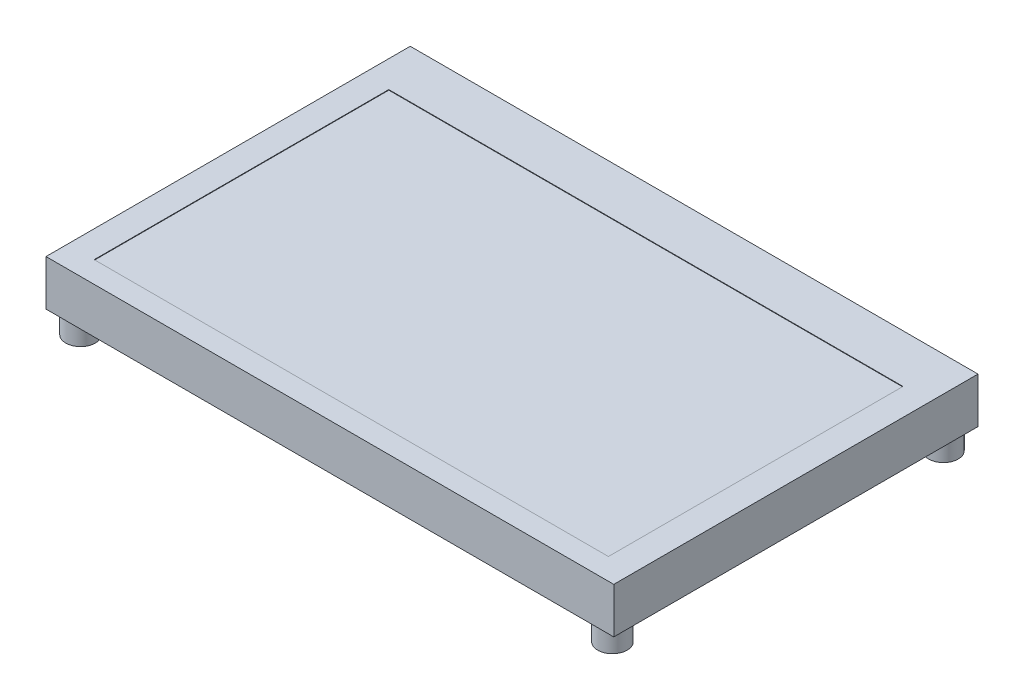
ISO-10303-21;
HEADER;
FILE_DESCRIPTION(('STEP AP214'),'2;1');
FILE_NAME('part.step','',(''),(''),'','','');
FILE_SCHEMA(('AUTOMOTIVE_DESIGN { 1 0 10303 214 1 1 1 1 }'));
ENDSEC;
DATA;
#1=APPLICATION_CONTEXT('core data for automotive mechanical design processes');
#2=APPLICATION_PROTOCOL_DEFINITION('international standard','automotive_design',2000,#1);
#3=PRODUCT_CONTEXT('',#1,'mechanical');
#4=PRODUCT('Part','Part','',(#3));
#5=PRODUCT_RELATED_PRODUCT_CATEGORY('part','',(#4));
#6=PRODUCT_DEFINITION_FORMATION('','',#4);
#7=PRODUCT_DEFINITION_CONTEXT('part definition',#1,'design');
#8=PRODUCT_DEFINITION('design','',#6,#7);
#9=PRODUCT_DEFINITION_SHAPE('','',#8);
#10=(LENGTH_UNIT() NAMED_UNIT(*) SI_UNIT(.MILLI.,.METRE.));
#11=(NAMED_UNIT(*) PLANE_ANGLE_UNIT() SI_UNIT($,.RADIAN.));
#12=(NAMED_UNIT(*) SI_UNIT($,.STERADIAN.) SOLID_ANGLE_UNIT());
#13=UNCERTAINTY_MEASURE_WITH_UNIT(LENGTH_MEASURE(1.E-05),#10,'distance_accuracy_value','');
#14=(GEOMETRIC_REPRESENTATION_CONTEXT(3) GLOBAL_UNCERTAINTY_ASSIGNED_CONTEXT((#13)) GLOBAL_UNIT_ASSIGNED_CONTEXT((#10,
#11,#12)) REPRESENTATION_CONTEXT('',''));
#15=CARTESIAN_POINT('',(0.,0.,0.));
#16=DIRECTION('',(0.,0.,1.));
#17=DIRECTION('',(1.,0.,0.));
#18=AXIS2_PLACEMENT_3D('',#15,#16,#17);
#19=CARTESIAN_POINT('',(53.,8.5,34.));
#20=DIRECTION('',(-1.,0.,0.));
#21=DIRECTION('',(0.,0.,1.));
#22=AXIS2_PLACEMENT_3D('',#19,#20,#21);
#23=PLANE('',#22);
#24=DIRECTION('',(0.,0.,-1.));
#25=VECTOR('',#24,1.);
#26=CARTESIAN_POINT('',(53.,0.,34.));
#27=LINE('',#26,#25);
#28=CARTESIAN_POINT('',(53.,0.,34.));
#29=VERTEX_POINT('',#28);
#30=CARTESIAN_POINT('',(53.,0.,-34.));
#31=VERTEX_POINT('',#30);
#32=EDGE_CURVE('E192',#29,#31,#27,.T.);
#33=ORIENTED_EDGE('',*,*,#32,.T.);
#34=DIRECTION('',(0.,-1.,0.));
#35=VECTOR('',#34,1.);
#36=CARTESIAN_POINT('',(53.,8.5,-34.));
#37=LINE('',#36,#35);
#38=CARTESIAN_POINT('',(53.,8.5,-34.));
#39=VERTEX_POINT('',#38);
#40=EDGE_CURVE('E11',#39,#31,#37,.T.);
#41=ORIENTED_EDGE('',*,*,#40,.F.);
#42=DIRECTION('',(0.,0.,-1.));
#43=VECTOR('',#42,1.);
#44=CARTESIAN_POINT('',(53.,8.5,34.));
#45=LINE('',#44,#43);
#46=CARTESIAN_POINT('',(53.,8.5,34.));
#47=VERTEX_POINT('',#46);
#48=EDGE_CURVE('E195',#47,#39,#45,.T.);
#49=ORIENTED_EDGE('',*,*,#48,.F.);
#50=DIRECTION('',(0.,-1.,0.));
#51=VECTOR('',#50,1.);
#52=CARTESIAN_POINT('',(53.,8.5,34.));
#53=LINE('',#52,#51);
#54=EDGE_CURVE('E201',#47,#29,#53,.T.);
#55=ORIENTED_EDGE('',*,*,#54,.T.);
#56=EDGE_LOOP('',(#33,#41,#49,#55));
#57=FACE_BOUND('',#56,.T.);
#58=ADVANCED_FACE('F35',(#57),#23,.F.);
#59=CARTESIAN_POINT('',(-53.,8.5,-34.));
#60=DIRECTION('',(0.,0.,1.));
#61=DIRECTION('',(1.,0.,0.));
#62=AXIS2_PLACEMENT_3D('',#59,#60,#61);
#63=PLANE('',#62);
#64=DIRECTION('',(-1.,0.,0.));
#65=VECTOR('',#64,1.);
#66=CARTESIAN_POINT('',(-53.,0.,-34.));
#67=LINE('',#66,#65);
#68=CARTESIAN_POINT('',(-53.,0.,-34.));
#69=VERTEX_POINT('',#68);
#70=EDGE_CURVE('E204',#31,#69,#67,.T.);
#71=ORIENTED_EDGE('',*,*,#70,.T.);
#72=DIRECTION('',(0.,-1.,0.));
#73=VECTOR('',#72,1.);
#74=CARTESIAN_POINT('',(-53.,8.5,-34.));
#75=LINE('',#74,#73);
#76=CARTESIAN_POINT('',(-53.,8.5,-34.));
#77=VERTEX_POINT('',#76);
#78=EDGE_CURVE('E42',#77,#69,#75,.T.);
#79=ORIENTED_EDGE('',*,*,#78,.F.);
#80=DIRECTION('',(-1.,0.,0.));
#81=VECTOR('',#80,1.);
#82=CARTESIAN_POINT('',(-53.,8.5,-34.));
#83=LINE('',#82,#81);
#84=EDGE_CURVE('E86',#39,#77,#83,.T.);
#85=ORIENTED_EDGE('',*,*,#84,.F.);
#86=ORIENTED_EDGE('',*,*,#40,.T.);
#87=EDGE_LOOP('',(#71,#79,#85,#86));
#88=FACE_BOUND('',#87,.T.);
#89=ADVANCED_FACE('F233',(#88),#63,.F.);
#90=CARTESIAN_POINT('',(-53.,8.5,34.));
#91=DIRECTION('',(1.,0.,0.));
#92=DIRECTION('',(0.,0.,-1.));
#93=AXIS2_PLACEMENT_3D('',#90,#91,#92);
#94=PLANE('',#93);
#95=DIRECTION('',(0.,0.,1.));
#96=VECTOR('',#95,1.);
#97=CARTESIAN_POINT('',(-53.,0.,34.));
#98=LINE('',#97,#96);
#99=CARTESIAN_POINT('',(-53.,0.,34.));
#100=VERTEX_POINT('',#99);
#101=EDGE_CURVE('E206',#69,#100,#98,.T.);
#102=ORIENTED_EDGE('',*,*,#101,.T.);
#103=DIRECTION('',(0.,-1.,0.));
#104=VECTOR('',#103,1.);
#105=CARTESIAN_POINT('',(-53.,8.5,34.));
#106=LINE('',#105,#104);
#107=CARTESIAN_POINT('',(-53.,8.5,34.));
#108=VERTEX_POINT('',#107);
#109=EDGE_CURVE('E210',#108,#100,#106,.T.);
#110=ORIENTED_EDGE('',*,*,#109,.F.);
#111=DIRECTION('',(0.,0.,1.));
#112=VECTOR('',#111,1.);
#113=CARTESIAN_POINT('',(-53.,8.5,34.));
#114=LINE('',#113,#112);
#115=EDGE_CURVE('E198',#77,#108,#114,.T.);
#116=ORIENTED_EDGE('',*,*,#115,.F.);
#117=ORIENTED_EDGE('',*,*,#78,.T.);
#118=EDGE_LOOP('',(#102,#110,#116,#117));
#119=FACE_BOUND('',#118,.T.);
#120=ADVANCED_FACE('F215',(#119),#94,.F.);
#121=CARTESIAN_POINT('',(-53.,8.5,34.));
#122=DIRECTION('',(0.,0.,-1.));
#123=DIRECTION('',(-1.,0.,0.));
#124=AXIS2_PLACEMENT_3D('',#121,#122,#123);
#125=PLANE('',#124);
#126=DIRECTION('',(1.,0.,0.));
#127=VECTOR('',#126,1.);
#128=CARTESIAN_POINT('',(-53.,0.,34.));
#129=LINE('',#128,#127);
#130=EDGE_CURVE('E79',#100,#29,#129,.T.);
#131=ORIENTED_EDGE('',*,*,#130,.T.);
#132=ORIENTED_EDGE('',*,*,#54,.F.);
#133=DIRECTION('',(1.,0.,0.));
#134=VECTOR('',#133,1.);
#135=CARTESIAN_POINT('',(-53.,8.5,34.));
#136=LINE('',#135,#134);
#137=EDGE_CURVE('E58',#108,#47,#136,.T.);
#138=ORIENTED_EDGE('',*,*,#137,.F.);
#139=ORIENTED_EDGE('',*,*,#109,.T.);
#140=EDGE_LOOP('',(#131,#132,#138,#139));
#141=FACE_BOUND('',#140,.T.);
#142=ADVANCED_FACE('F223',(#141),#125,.F.);
#143=CARTESIAN_POINT('',(0.,8.5,0.));
#144=DIRECTION('',(0.,-1.,0.));
#145=DIRECTION('',(0.,0.,-1.));
#146=AXIS2_PLACEMENT_3D('',#143,#144,#145);
#147=PLANE('',#146);
#148=DIRECTION('',(-1.,0.,0.));
#149=VECTOR('',#148,1.);
#150=CARTESIAN_POINT('',(48.,8.5,-25.));
#151=LINE('',#150,#149);
#152=CARTESIAN_POINT('',(48.,8.5,-25.));
#153=VERTEX_POINT('',#152);
#154=CARTESIAN_POINT('',(-48.,8.5,-25.));
#155=VERTEX_POINT('',#154);
#156=EDGE_CURVE('E137',#153,#155,#151,.T.);
#157=ORIENTED_EDGE('',*,*,#156,.F.);
#158=DIRECTION('',(0.,0.,-1.));
#159=VECTOR('',#158,1.);
#160=CARTESIAN_POINT('',(48.,8.5,30.));
#161=LINE('',#160,#159);
#162=CARTESIAN_POINT('',(48.,8.5,30.));
#163=VERTEX_POINT('',#162);
#164=EDGE_CURVE('E49',#163,#153,#161,.T.);
#165=ORIENTED_EDGE('',*,*,#164,.F.);
#166=DIRECTION('',(1.,0.,0.));
#167=VECTOR('',#166,1.);
#168=CARTESIAN_POINT('',(48.,8.5,30.));
#169=LINE('',#168,#167);
#170=CARTESIAN_POINT('',(-48.,8.5,30.));
#171=VERTEX_POINT('',#170);
#172=EDGE_CURVE('E128',#171,#163,#169,.T.);
#173=ORIENTED_EDGE('',*,*,#172,.F.);
#174=DIRECTION('',(0.,0.,1.));
#175=VECTOR('',#174,1.);
#176=CARTESIAN_POINT('',(-48.,8.5,30.));
#177=LINE('',#176,#175);
#178=EDGE_CURVE('E131',#155,#171,#177,.T.);
#179=ORIENTED_EDGE('',*,*,#178,.F.);
#180=EDGE_LOOP('',(#157,#165,#173,#179));
#181=FACE_BOUND('',#180,.T.);
#182=ORIENTED_EDGE('',*,*,#48,.T.);
#183=ORIENTED_EDGE('',*,*,#84,.T.);
#184=ORIENTED_EDGE('',*,*,#115,.T.);
#185=ORIENTED_EDGE('',*,*,#137,.T.);
#186=EDGE_LOOP('',(#182,#183,#184,#185));
#187=FACE_BOUND('',#186,.T.);
#188=ADVANCED_FACE('F225',(#181,#187),#147,.F.);
#189=CARTESIAN_POINT('',(0.,0.,0.));
#190=DIRECTION('',(0.,-1.,0.));
#191=DIRECTION('',(0.,0.,-1.));
#192=AXIS2_PLACEMENT_3D('',#189,#190,#191);
#193=PLANE('',#192);
#194=CARTESIAN_POINT('',(30.62,0.,-24.54));
#195=DIRECTION('',(0.,-1.,0.));
#196=DIRECTION('',(0.,0.,-1.));
#197=AXIS2_PLACEMENT_3D('',#194,#195,#196);
#198=CIRCLE('',#197,2.75);
#199=CARTESIAN_POINT('',(30.62,0.,-27.29));
#200=VERTEX_POINT('',#199);
#201=EDGE_CURVE('E143',#200,#200,#198,.T.);
#202=ORIENTED_EDGE('',*,*,#201,.F.);
#203=EDGE_LOOP('',(#202));
#204=FACE_BOUND('',#203,.T.);
#205=CARTESIAN_POINT('',(-27.38,0.,-24.54));
#206=DIRECTION('',(0.,-1.,0.));
#207=DIRECTION('',(0.,0.,-1.));
#208=AXIS2_PLACEMENT_3D('',#205,#206,#207);
#209=CIRCLE('',#208,2.75);
#210=CARTESIAN_POINT('',(-27.38,0.,-27.29));
#211=VERTEX_POINT('',#210);
#212=EDGE_CURVE('E150',#211,#211,#209,.T.);
#213=ORIENTED_EDGE('',*,*,#212,.F.);
#214=EDGE_LOOP('',(#213));
#215=FACE_BOUND('',#214,.T.);
#216=CARTESIAN_POINT('',(30.62,0.,24.5));
#217=DIRECTION('',(0.,-1.,0.));
#218=DIRECTION('',(0.,0.,-1.));
#219=AXIS2_PLACEMENT_3D('',#216,#217,#218);
#220=CIRCLE('',#219,2.75);
#221=CARTESIAN_POINT('',(30.62,0.,21.75));
#222=VERTEX_POINT('',#221);
#223=EDGE_CURVE('E156',#222,#222,#220,.T.);
#224=ORIENTED_EDGE('',*,*,#223,.F.);
#225=EDGE_LOOP('',(#224));
#226=FACE_BOUND('',#225,.T.);
#227=CARTESIAN_POINT('',(-27.38,0.,24.5));
#228=DIRECTION('',(0.,-1.,0.));
#229=DIRECTION('',(0.,0.,-1.));
#230=AXIS2_PLACEMENT_3D('',#227,#228,#229);
#231=CIRCLE('',#230,2.75);
#232=CARTESIAN_POINT('',(-27.38,0.,21.75));
#233=VERTEX_POINT('',#232);
#234=EDGE_CURVE('E162',#233,#233,#231,.T.);
#235=ORIENTED_EDGE('',*,*,#234,.F.);
#236=EDGE_LOOP('',(#235));
#237=FACE_BOUND('',#236,.T.);
#238=CARTESIAN_POINT('',(49.65,0.,-30.9));
#239=DIRECTION('',(0.,-1.,0.));
#240=DIRECTION('',(0.,0.,-1.));
#241=AXIS2_PLACEMENT_3D('',#238,#239,#240);
#242=CIRCLE('',#241,2.75);
#243=CARTESIAN_POINT('',(49.65,0.,-33.65));
#244=VERTEX_POINT('',#243);
#245=EDGE_CURVE('E168',#244,#244,#242,.T.);
#246=ORIENTED_EDGE('',*,*,#245,.F.);
#247=EDGE_LOOP('',(#246));
#248=FACE_BOUND('',#247,.T.);
#249=CARTESIAN_POINT('',(-49.65,0.,-30.9));
#250=DIRECTION('',(0.,-1.,0.));
#251=DIRECTION('',(0.,0.,-1.));
#252=AXIS2_PLACEMENT_3D('',#249,#250,#251);
#253=CIRCLE('',#252,2.75);
#254=CARTESIAN_POINT('',(-49.65,0.,-33.65));
#255=VERTEX_POINT('',#254);
#256=EDGE_CURVE('E174',#255,#255,#253,.T.);
#257=ORIENTED_EDGE('',*,*,#256,.F.);
#258=EDGE_LOOP('',(#257));
#259=FACE_BOUND('',#258,.T.);
#260=CARTESIAN_POINT('',(49.65,0.,30.9));
#261=DIRECTION('',(0.,-1.,0.));
#262=DIRECTION('',(0.,0.,-1.));
#263=AXIS2_PLACEMENT_3D('',#260,#261,#262);
#264=CIRCLE('',#263,2.75);
#265=CARTESIAN_POINT('',(49.65,0.,28.15));
#266=VERTEX_POINT('',#265);
#267=EDGE_CURVE('E180',#266,#266,#264,.T.);
#268=ORIENTED_EDGE('',*,*,#267,.F.);
#269=EDGE_LOOP('',(#268));
#270=FACE_BOUND('',#269,.T.);
#271=CARTESIAN_POINT('',(-49.65,0.,30.9));
#272=DIRECTION('',(0.,-1.,0.));
#273=DIRECTION('',(0.,0.,-1.));
#274=AXIS2_PLACEMENT_3D('',#271,#272,#273);
#275=CIRCLE('',#274,2.75);
#276=CARTESIAN_POINT('',(-49.65,0.,28.15));
#277=VERTEX_POINT('',#276);
#278=EDGE_CURVE('E186',#277,#277,#275,.T.);
#279=ORIENTED_EDGE('',*,*,#278,.F.);
#280=EDGE_LOOP('',(#279));
#281=FACE_BOUND('',#280,.T.);
#282=ORIENTED_EDGE('',*,*,#32,.F.);
#283=ORIENTED_EDGE('',*,*,#130,.F.);
#284=ORIENTED_EDGE('',*,*,#101,.F.);
#285=ORIENTED_EDGE('',*,*,#70,.F.);
#286=EDGE_LOOP('',(#282,#283,#284,#285));
#287=FACE_BOUND('',#286,.T.);
#288=ADVANCED_FACE('F219',(#204,#215,#226,#237,#248,#259,#270,#281,#287),#193,.T.);
#289=CARTESIAN_POINT('',(-49.65,-4.,30.9));
#290=DIRECTION('',(0.,1.,0.));
#291=DIRECTION('',(0.,0.,1.));
#292=AXIS2_PLACEMENT_3D('',#289,#290,#291);
#293=CYLINDRICAL_SURFACE('',#292,2.75);
#294=CARTESIAN_POINT('',(-49.65,-4.,30.9));
#295=DIRECTION('',(0.,-1.,0.));
#296=DIRECTION('',(0.,0.,-1.));
#297=AXIS2_PLACEMENT_3D('',#294,#295,#296);
#298=CIRCLE('',#297,2.75);
#299=CARTESIAN_POINT('',(-49.65,-4.,28.15));
#300=VERTEX_POINT('',#299);
#301=EDGE_CURVE('E189',#300,#300,#298,.T.);
#302=ORIENTED_EDGE('',*,*,#301,.F.);
#303=EDGE_LOOP('',(#302));
#304=FACE_BOUND('',#303,.T.);
#305=ORIENTED_EDGE('',*,*,#278,.T.);
#306=EDGE_LOOP('',(#305));
#307=FACE_BOUND('',#306,.T.);
#308=ADVANCED_FACE('F270',(#304,#307),#293,.T.);
#309=CARTESIAN_POINT('',(-49.65,-4.,30.9));
#310=DIRECTION('',(0.,-1.,0.));
#311=DIRECTION('',(0.,0.,-1.));
#312=AXIS2_PLACEMENT_3D('',#309,#310,#311);
#313=PLANE('',#312);
#314=ORIENTED_EDGE('',*,*,#301,.T.);
#315=EDGE_LOOP('',(#314));
#316=FACE_BOUND('',#315,.T.);
#317=ADVANCED_FACE('F277',(#316),#313,.T.);
#318=CARTESIAN_POINT('',(49.65,-4.,30.9));
#319=DIRECTION('',(0.,1.,0.));
#320=DIRECTION('',(0.,0.,1.));
#321=AXIS2_PLACEMENT_3D('',#318,#319,#320);
#322=CYLINDRICAL_SURFACE('',#321,2.75);
#323=CARTESIAN_POINT('',(49.65,-4.,30.9));
#324=DIRECTION('',(0.,-1.,0.));
#325=DIRECTION('',(0.,0.,-1.));
#326=AXIS2_PLACEMENT_3D('',#323,#324,#325);
#327=CIRCLE('',#326,2.75);
#328=CARTESIAN_POINT('',(49.65,-4.,28.15));
#329=VERTEX_POINT('',#328);
#330=EDGE_CURVE('E183',#329,#329,#327,.T.);
#331=ORIENTED_EDGE('',*,*,#330,.F.);
#332=EDGE_LOOP('',(#331));
#333=FACE_BOUND('',#332,.T.);
#334=ORIENTED_EDGE('',*,*,#267,.T.);
#335=EDGE_LOOP('',(#334));
#336=FACE_BOUND('',#335,.T.);
#337=ADVANCED_FACE('F285',(#333,#336),#322,.T.);
#338=CARTESIAN_POINT('',(49.65,-4.,30.9));
#339=DIRECTION('',(0.,-1.,0.));
#340=DIRECTION('',(0.,0.,-1.));
#341=AXIS2_PLACEMENT_3D('',#338,#339,#340);
#342=PLANE('',#341);
#343=ORIENTED_EDGE('',*,*,#330,.T.);
#344=EDGE_LOOP('',(#343));
#345=FACE_BOUND('',#344,.T.);
#346=ADVANCED_FACE('F293',(#345),#342,.T.);
#347=CARTESIAN_POINT('',(-49.65,-4.,-30.9));
#348=DIRECTION('',(0.,1.,0.));
#349=DIRECTION('',(0.,0.,1.));
#350=AXIS2_PLACEMENT_3D('',#347,#348,#349);
#351=CYLINDRICAL_SURFACE('',#350,2.75);
#352=CARTESIAN_POINT('',(-49.65,-4.,-30.9));
#353=DIRECTION('',(0.,-1.,0.));
#354=DIRECTION('',(0.,0.,-1.));
#355=AXIS2_PLACEMENT_3D('',#352,#353,#354);
#356=CIRCLE('',#355,2.75);
#357=CARTESIAN_POINT('',(-49.65,-4.,-33.65));
#358=VERTEX_POINT('',#357);
#359=EDGE_CURVE('E177',#358,#358,#356,.T.);
#360=ORIENTED_EDGE('',*,*,#359,.F.);
#361=EDGE_LOOP('',(#360));
#362=FACE_BOUND('',#361,.T.);
#363=ORIENTED_EDGE('',*,*,#256,.T.);
#364=EDGE_LOOP('',(#363));
#365=FACE_BOUND('',#364,.T.);
#366=ADVANCED_FACE('F301',(#362,#365),#351,.T.);
#367=CARTESIAN_POINT('',(-49.65,-4.,-30.9));
#368=DIRECTION('',(0.,-1.,0.));
#369=DIRECTION('',(0.,0.,-1.));
#370=AXIS2_PLACEMENT_3D('',#367,#368,#369);
#371=PLANE('',#370);
#372=ORIENTED_EDGE('',*,*,#359,.T.);
#373=EDGE_LOOP('',(#372));
#374=FACE_BOUND('',#373,.T.);
#375=ADVANCED_FACE('F309',(#374),#371,.T.);
#376=CARTESIAN_POINT('',(49.65,-4.,-30.9));
#377=DIRECTION('',(0.,1.,0.));
#378=DIRECTION('',(0.,0.,1.));
#379=AXIS2_PLACEMENT_3D('',#376,#377,#378);
#380=CYLINDRICAL_SURFACE('',#379,2.75);
#381=CARTESIAN_POINT('',(49.65,-4.,-30.9));
#382=DIRECTION('',(0.,-1.,0.));
#383=DIRECTION('',(0.,0.,-1.));
#384=AXIS2_PLACEMENT_3D('',#381,#382,#383);
#385=CIRCLE('',#384,2.75);
#386=CARTESIAN_POINT('',(49.65,-4.,-33.65));
#387=VERTEX_POINT('',#386);
#388=EDGE_CURVE('E171',#387,#387,#385,.T.);
#389=ORIENTED_EDGE('',*,*,#388,.F.);
#390=EDGE_LOOP('',(#389));
#391=FACE_BOUND('',#390,.T.);
#392=ORIENTED_EDGE('',*,*,#245,.T.);
#393=EDGE_LOOP('',(#392));
#394=FACE_BOUND('',#393,.T.);
#395=ADVANCED_FACE('F317',(#391,#394),#380,.T.);
#396=CARTESIAN_POINT('',(49.65,-4.,-30.9));
#397=DIRECTION('',(0.,-1.,0.));
#398=DIRECTION('',(0.,0.,-1.));
#399=AXIS2_PLACEMENT_3D('',#396,#397,#398);
#400=PLANE('',#399);
#401=ORIENTED_EDGE('',*,*,#388,.T.);
#402=EDGE_LOOP('',(#401));
#403=FACE_BOUND('',#402,.T.);
#404=ADVANCED_FACE('F325',(#403),#400,.T.);
#405=CARTESIAN_POINT('',(-27.38,-4.,24.5));
#406=DIRECTION('',(0.,1.,0.));
#407=DIRECTION('',(0.,0.,1.));
#408=AXIS2_PLACEMENT_3D('',#405,#406,#407);
#409=CYLINDRICAL_SURFACE('',#408,2.75);
#410=CARTESIAN_POINT('',(-27.38,-4.,24.5));
#411=DIRECTION('',(0.,-1.,0.));
#412=DIRECTION('',(0.,0.,-1.));
#413=AXIS2_PLACEMENT_3D('',#410,#411,#412);
#414=CIRCLE('',#413,2.75);
#415=CARTESIAN_POINT('',(-27.38,-4.,21.75));
#416=VERTEX_POINT('',#415);
#417=EDGE_CURVE('E165',#416,#416,#414,.T.);
#418=ORIENTED_EDGE('',*,*,#417,.F.);
#419=EDGE_LOOP('',(#418));
#420=FACE_BOUND('',#419,.T.);
#421=ORIENTED_EDGE('',*,*,#234,.T.);
#422=EDGE_LOOP('',(#421));
#423=FACE_BOUND('',#422,.T.);
#424=ADVANCED_FACE('F333',(#420,#423),#409,.T.);
#425=CARTESIAN_POINT('',(-27.38,-4.,24.5));
#426=DIRECTION('',(0.,-1.,0.));
#427=DIRECTION('',(0.,0.,-1.));
#428=AXIS2_PLACEMENT_3D('',#425,#426,#427);
#429=PLANE('',#428);
#430=ORIENTED_EDGE('',*,*,#417,.T.);
#431=EDGE_LOOP('',(#430));
#432=FACE_BOUND('',#431,.T.);
#433=ADVANCED_FACE('F341',(#432),#429,.T.);
#434=CARTESIAN_POINT('',(30.62,-4.,24.5));
#435=DIRECTION('',(0.,1.,0.));
#436=DIRECTION('',(0.,0.,1.));
#437=AXIS2_PLACEMENT_3D('',#434,#435,#436);
#438=CYLINDRICAL_SURFACE('',#437,2.75);
#439=CARTESIAN_POINT('',(30.62,-4.,24.5));
#440=DIRECTION('',(0.,-1.,0.));
#441=DIRECTION('',(0.,0.,-1.));
#442=AXIS2_PLACEMENT_3D('',#439,#440,#441);
#443=CIRCLE('',#442,2.75);
#444=CARTESIAN_POINT('',(30.62,-4.,21.75));
#445=VERTEX_POINT('',#444);
#446=EDGE_CURVE('E159',#445,#445,#443,.T.);
#447=ORIENTED_EDGE('',*,*,#446,.F.);
#448=EDGE_LOOP('',(#447));
#449=FACE_BOUND('',#448,.T.);
#450=ORIENTED_EDGE('',*,*,#223,.T.);
#451=EDGE_LOOP('',(#450));
#452=FACE_BOUND('',#451,.T.);
#453=ADVANCED_FACE('F349',(#449,#452),#438,.T.);
#454=CARTESIAN_POINT('',(30.62,-4.,24.5));
#455=DIRECTION('',(0.,-1.,0.));
#456=DIRECTION('',(0.,0.,-1.));
#457=AXIS2_PLACEMENT_3D('',#454,#455,#456);
#458=PLANE('',#457);
#459=ORIENTED_EDGE('',*,*,#446,.T.);
#460=EDGE_LOOP('',(#459));
#461=FACE_BOUND('',#460,.T.);
#462=ADVANCED_FACE('F357',(#461),#458,.T.);
#463=CARTESIAN_POINT('',(-27.38,-4.,-24.54));
#464=DIRECTION('',(0.,1.,0.));
#465=DIRECTION('',(0.,0.,1.));
#466=AXIS2_PLACEMENT_3D('',#463,#464,#465);
#467=CYLINDRICAL_SURFACE('',#466,2.75);
#468=CARTESIAN_POINT('',(-27.38,-4.,-24.54));
#469=DIRECTION('',(0.,-1.,0.));
#470=DIRECTION('',(0.,0.,-1.));
#471=AXIS2_PLACEMENT_3D('',#468,#469,#470);
#472=CIRCLE('',#471,2.75);
#473=CARTESIAN_POINT('',(-27.38,-4.,-27.29));
#474=VERTEX_POINT('',#473);
#475=EDGE_CURVE('E153',#474,#474,#472,.T.);
#476=ORIENTED_EDGE('',*,*,#475,.F.);
#477=EDGE_LOOP('',(#476));
#478=FACE_BOUND('',#477,.T.);
#479=ORIENTED_EDGE('',*,*,#212,.T.);
#480=EDGE_LOOP('',(#479));
#481=FACE_BOUND('',#480,.T.);
#482=ADVANCED_FACE('F365',(#478,#481),#467,.T.);
#483=CARTESIAN_POINT('',(-27.38,-4.,-24.54));
#484=DIRECTION('',(0.,-1.,0.));
#485=DIRECTION('',(0.,0.,-1.));
#486=AXIS2_PLACEMENT_3D('',#483,#484,#485);
#487=PLANE('',#486);
#488=ORIENTED_EDGE('',*,*,#475,.T.);
#489=EDGE_LOOP('',(#488));
#490=FACE_BOUND('',#489,.T.);
#491=ADVANCED_FACE('F373',(#490),#487,.T.);
#492=CARTESIAN_POINT('',(30.62,-4.,-24.54));
#493=DIRECTION('',(0.,1.,0.));
#494=DIRECTION('',(0.,0.,1.));
#495=AXIS2_PLACEMENT_3D('',#492,#493,#494);
#496=CYLINDRICAL_SURFACE('',#495,2.75);
#497=CARTESIAN_POINT('',(30.62,-4.,-24.54));
#498=DIRECTION('',(0.,-1.,0.));
#499=DIRECTION('',(0.,0.,-1.));
#500=AXIS2_PLACEMENT_3D('',#497,#498,#499);
#501=CIRCLE('',#500,2.75);
#502=CARTESIAN_POINT('',(30.62,-4.,-27.29));
#503=VERTEX_POINT('',#502);
#504=EDGE_CURVE('E147',#503,#503,#501,.T.);
#505=ORIENTED_EDGE('',*,*,#504,.F.);
#506=EDGE_LOOP('',(#505));
#507=FACE_BOUND('',#506,.T.);
#508=ORIENTED_EDGE('',*,*,#201,.T.);
#509=EDGE_LOOP('',(#508));
#510=FACE_BOUND('',#509,.T.);
#511=ADVANCED_FACE('F381',(#507,#510),#496,.T.);
#512=CARTESIAN_POINT('',(30.62,-4.,-24.54));
#513=DIRECTION('',(0.,-1.,0.));
#514=DIRECTION('',(0.,0.,-1.));
#515=AXIS2_PLACEMENT_3D('',#512,#513,#514);
#516=PLANE('',#515);
#517=ORIENTED_EDGE('',*,*,#504,.T.);
#518=EDGE_LOOP('',(#517));
#519=FACE_BOUND('',#518,.T.);
#520=ADVANCED_FACE('F389',(#519),#516,.T.);
#521=CARTESIAN_POINT('',(48.,8.4,30.));
#522=DIRECTION('',(1.,0.,0.));
#523=DIRECTION('',(0.,0.,-1.));
#524=AXIS2_PLACEMENT_3D('',#521,#522,#523);
#525=PLANE('',#524);
#526=ORIENTED_EDGE('',*,*,#164,.T.);
#527=DIRECTION('',(0.,1.,0.));
#528=VECTOR('',#527,1.);
#529=CARTESIAN_POINT('',(48.,8.4,-25.));
#530=LINE('',#529,#528);
#531=CARTESIAN_POINT('',(48.,8.4,-25.));
#532=VERTEX_POINT('',#531);
#533=EDGE_CURVE('E106',#532,#153,#530,.T.);
#534=ORIENTED_EDGE('',*,*,#533,.F.);
#535=DIRECTION('',(0.,0.,-1.));
#536=VECTOR('',#535,1.);
#537=CARTESIAN_POINT('',(48.,8.4,30.));
#538=LINE('',#537,#536);
#539=CARTESIAN_POINT('',(48.,8.4,30.));
#540=VERTEX_POINT('',#539);
#541=EDGE_CURVE('E110',#540,#532,#538,.T.);
#542=ORIENTED_EDGE('',*,*,#541,.F.);
#543=DIRECTION('',(0.,1.,0.));
#544=VECTOR('',#543,1.);
#545=CARTESIAN_POINT('',(48.,8.4,30.));
#546=LINE('',#545,#544);
#547=EDGE_CURVE('E141',#540,#163,#546,.T.);
#548=ORIENTED_EDGE('',*,*,#547,.T.);
#549=EDGE_LOOP('',(#526,#534,#542,#548));
#550=FACE_BOUND('',#549,.T.);
#551=ADVANCED_FACE('F108',(#550),#525,.F.);
#552=CARTESIAN_POINT('',(48.,8.4,30.));
#553=DIRECTION('',(0.,0.,1.));
#554=DIRECTION('',(1.,0.,0.));
#555=AXIS2_PLACEMENT_3D('',#552,#553,#554);
#556=PLANE('',#555);
#557=ORIENTED_EDGE('',*,*,#172,.T.);
#558=ORIENTED_EDGE('',*,*,#547,.F.);
#559=DIRECTION('',(1.,0.,0.));
#560=VECTOR('',#559,1.);
#561=CARTESIAN_POINT('',(48.,8.4,30.));
#562=LINE('',#561,#560);
#563=CARTESIAN_POINT('',(-48.,8.4,30.));
#564=VERTEX_POINT('',#563);
#565=EDGE_CURVE('E116',#564,#540,#562,.T.);
#566=ORIENTED_EDGE('',*,*,#565,.F.);
#567=DIRECTION('',(0.,1.,0.));
#568=VECTOR('',#567,1.);
#569=CARTESIAN_POINT('',(-48.,8.4,30.));
#570=LINE('',#569,#568);
#571=EDGE_CURVE('E144',#564,#171,#570,.T.);
#572=ORIENTED_EDGE('',*,*,#571,.T.);
#573=EDGE_LOOP('',(#557,#558,#566,#572));
#574=FACE_BOUND('',#573,.T.);
#575=ADVANCED_FACE('F402',(#574),#556,.F.);
#576=CARTESIAN_POINT('',(-48.,8.4,30.));
#577=DIRECTION('',(-1.,0.,0.));
#578=DIRECTION('',(0.,0.,1.));
#579=AXIS2_PLACEMENT_3D('',#576,#577,#578);
#580=PLANE('',#579);
#581=ORIENTED_EDGE('',*,*,#178,.T.);
#582=ORIENTED_EDGE('',*,*,#571,.F.);
#583=DIRECTION('',(0.,0.,1.));
#584=VECTOR('',#583,1.);
#585=CARTESIAN_POINT('',(-48.,8.4,30.));
#586=LINE('',#585,#584);
#587=CARTESIAN_POINT('',(-48.,8.4,-25.));
#588=VERTEX_POINT('',#587);
#589=EDGE_CURVE('E124',#588,#564,#586,.T.);
#590=ORIENTED_EDGE('',*,*,#589,.F.);
#591=DIRECTION('',(0.,1.,0.));
#592=VECTOR('',#591,1.);
#593=CARTESIAN_POINT('',(-48.,8.4,-25.));
#594=LINE('',#593,#592);
#595=EDGE_CURVE('E115',#588,#155,#594,.T.);
#596=ORIENTED_EDGE('',*,*,#595,.T.);
#597=EDGE_LOOP('',(#581,#582,#590,#596));
#598=FACE_BOUND('',#597,.T.);
#599=ADVANCED_FACE('F409',(#598),#580,.F.);
#600=CARTESIAN_POINT('',(48.,8.4,-25.));
#601=DIRECTION('',(0.,0.,-1.));
#602=DIRECTION('',(-1.,0.,0.));
#603=AXIS2_PLACEMENT_3D('',#600,#601,#602);
#604=PLANE('',#603);
#605=ORIENTED_EDGE('',*,*,#156,.T.);
#606=ORIENTED_EDGE('',*,*,#595,.F.);
#607=DIRECTION('',(-1.,0.,0.));
#608=VECTOR('',#607,1.);
#609=CARTESIAN_POINT('',(48.,8.4,-25.));
#610=LINE('',#609,#608);
#611=EDGE_CURVE('E119',#532,#588,#610,.T.);
#612=ORIENTED_EDGE('',*,*,#611,.F.);
#613=ORIENTED_EDGE('',*,*,#533,.T.);
#614=EDGE_LOOP('',(#605,#606,#612,#613));
#615=FACE_BOUND('',#614,.T.);
#616=ADVANCED_FACE('F120',(#615),#604,.F.);
#617=CARTESIAN_POINT('',(0.,8.4,0.));
#618=DIRECTION('',(0.,1.,0.));
#619=DIRECTION('',(0.,0.,1.));
#620=AXIS2_PLACEMENT_3D('',#617,#618,#619);
#621=PLANE('',#620);
#622=ORIENTED_EDGE('',*,*,#541,.T.);
#623=ORIENTED_EDGE('',*,*,#611,.T.);
#624=ORIENTED_EDGE('',*,*,#589,.T.);
#625=ORIENTED_EDGE('',*,*,#565,.T.);
#626=EDGE_LOOP('',(#622,#623,#624,#625));
#627=FACE_BOUND('',#626,.T.);
#628=ADVANCED_FACE('F126',(#627),#621,.T.);
#629=CLOSED_SHELL('',(#58,#89,#120,#142,#188,#288,#308,#317,#337,#346,#366,#375,#395,#404,#424,
#433,#453,#462,#482,#491,#511,#520,#551,#575,#599,#616,#628));
#630=MANIFOLD_SOLID_BREP('B2',#629);
#631=ADVANCED_BREP_SHAPE_REPRESENTATION('',(#18,#630),#14);
#632=SHAPE_DEFINITION_REPRESENTATION(#9,#631);
ENDSEC;
END-ISO-10303-21;
